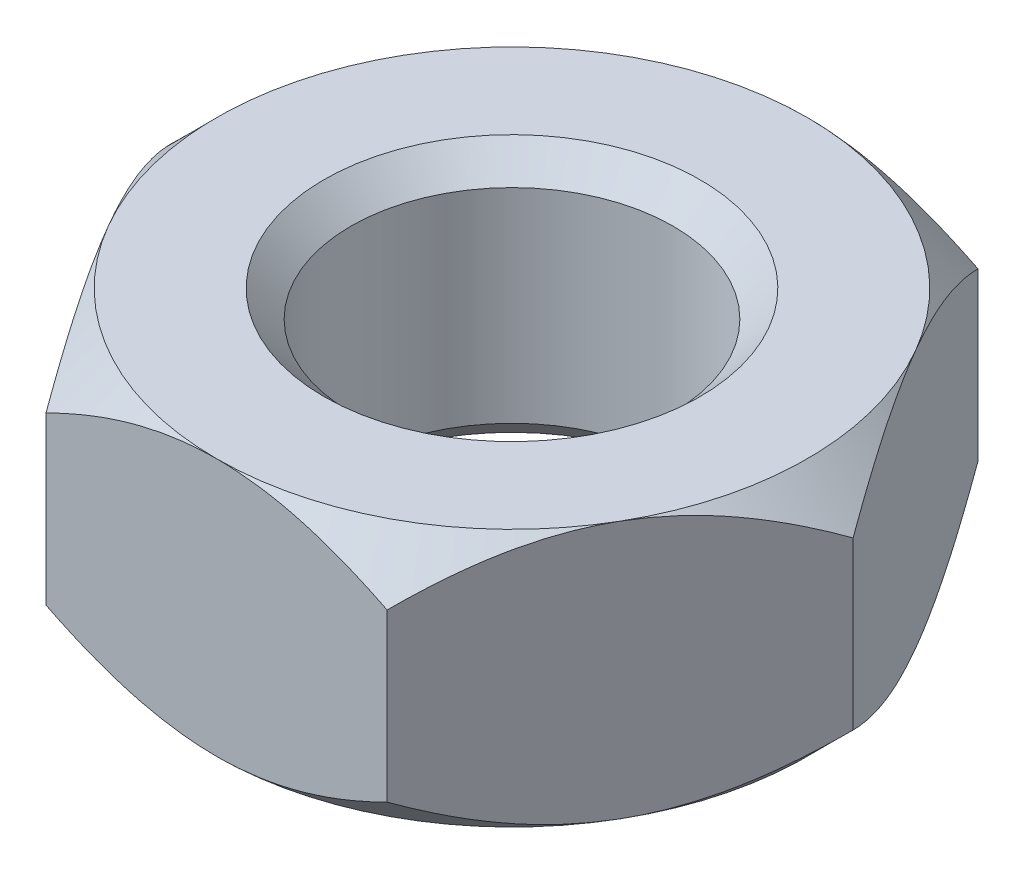
ISO-10303-21;
HEADER;
FILE_DESCRIPTION(('STEP AP214'),'2;1');
FILE_NAME('part.step','',(''),(''),'','','');
FILE_SCHEMA(('AUTOMOTIVE_DESIGN { 1 0 10303 214 1 1 1 1 }'));
ENDSEC;
DATA;
#1=APPLICATION_CONTEXT('core data for automotive mechanical design processes');
#2=APPLICATION_PROTOCOL_DEFINITION('international standard','automotive_design',2000,#1);
#3=PRODUCT_CONTEXT('',#1,'mechanical');
#4=PRODUCT('Part','Part','',(#3));
#5=PRODUCT_RELATED_PRODUCT_CATEGORY('part','',(#4));
#6=PRODUCT_DEFINITION_FORMATION('','',#4);
#7=PRODUCT_DEFINITION_CONTEXT('part definition',#1,'design');
#8=PRODUCT_DEFINITION('design','',#6,#7);
#9=PRODUCT_DEFINITION_SHAPE('','',#8);
#10=(LENGTH_UNIT() NAMED_UNIT(*) SI_UNIT(.MILLI.,.METRE.));
#11=(NAMED_UNIT(*) PLANE_ANGLE_UNIT() SI_UNIT($,.RADIAN.));
#12=(NAMED_UNIT(*) SI_UNIT($,.STERADIAN.) SOLID_ANGLE_UNIT());
#13=UNCERTAINTY_MEASURE_WITH_UNIT(LENGTH_MEASURE(1.E-05),#10,'distance_accuracy_value','');
#14=(GEOMETRIC_REPRESENTATION_CONTEXT(3) GLOBAL_UNCERTAINTY_ASSIGNED_CONTEXT((#13)) GLOBAL_UNIT_ASSIGNED_CONTEXT((#10,
#11,#12)) REPRESENTATION_CONTEXT('',''));
#15=CARTESIAN_POINT('',(0.,0.,0.));
#16=DIRECTION('',(0.,0.,1.));
#17=DIRECTION('',(1.,0.,0.));
#18=AXIS2_PLACEMENT_3D('',#15,#16,#17);
#19=CARTESIAN_POINT('',(0.,2.4,2.75));
#20=DIRECTION('',(0.,0.,-1.));
#21=DIRECTION('',(-1.,0.,0.));
#22=AXIS2_PLACEMENT_3D('',#19,#20,#21);
#23=PLANE('',#22);
#24=CARTESIAN_POINT('',(-3.57112123048818,1.75726156805253,2.75));
#25=CARTESIAN_POINT('',(-3.48574430504437,1.6896318648555,2.75));
#26=CARTESIAN_POINT('',(-3.39993787766819,1.62253635664774,2.75));
#27=CARTESIAN_POINT('',(-3.22728052865908,1.4896656720613,2.75));
#28=CARTESIAN_POINT('',(-3.14042938728946,1.42389078149977,2.75));
#29=CARTESIAN_POINT('',(-2.96486869524019,1.29344848280675,2.75));
#30=CARTESIAN_POINT('',(-2.8761500356758,1.22879329655884,2.75));
#31=CARTESIAN_POINT('',(-2.69729269204007,1.10148535993676,2.75));
#32=CARTESIAN_POINT('',(-2.60715410326676,1.03883247602641,2.75));
#33=CARTESIAN_POINT('',(-2.41840275638711,0.911415572467526,2.75));
#34=CARTESIAN_POINT('',(-2.3196598853465,0.846843352358625,2.75));
#35=CARTESIAN_POINT('',(-2.11984686682476,0.721340304065986,2.75));
#36=CARTESIAN_POINT('',(-2.01877629430811,0.660410148339995,2.75));
#37=CARTESIAN_POINT('',(-1.81421853991552,0.543458089462744,2.75));
#38=CARTESIAN_POINT('',(-1.71073958578057,0.487421907433462,2.75));
#39=CARTESIAN_POINT('',(-1.50069861159212,0.381513269750787,2.75));
#40=CARTESIAN_POINT('',(-1.39413817091264,0.331637723301281,2.75));
#41=CARTESIAN_POINT('',(-1.19118474473753,0.245675860330104,2.75));
#42=CARTESIAN_POINT('',(-1.09519613390678,0.208644392579135,2.75));
#43=CARTESIAN_POINT('',(-0.900551286140332,0.14225363721217,2.75));
#44=CARTESIAN_POINT('',(-0.801894895995169,0.112894791268699,2.75));
#45=CARTESIAN_POINT('',(-0.604366756853834,0.0640380979222952,2.75));
#46=CARTESIAN_POINT('',(-0.505544728188573,0.0443428042195567,2.75));
#47=CARTESIAN_POINT('',(-0.306386291852734,0.0152643735237227,2.75));
#48=CARTESIAN_POINT('',(-0.206050319541373,0.00587832714519468,2.75));
#49=CARTESIAN_POINT('',(-0.0108664169761356,-0.00160558688675908,2.75));
#50=CARTESIAN_POINT('',(0.083957271079694,-0.0003348017554669,2.75));
#51=CARTESIAN_POINT('',(0.27297134425492,0.0119042729439363,2.75));
#52=CARTESIAN_POINT('',(0.367161679433115,0.0228733184108846,2.75));
#53=CARTESIAN_POINT('',(0.555841326304052,0.0540372019465188,2.75));
#54=CARTESIAN_POINT('',(0.650301484227614,0.0744055867829754,2.75));
#55=CARTESIAN_POINT('',(0.837080407271525,0.123164499288071,2.75));
#56=CARTESIAN_POINT('',(0.92939918565339,0.151554977261706,2.75));
#57=CARTESIAN_POINT('',(1.20448144887619,0.247241103955768,2.75));
#58=CARTESIAN_POINT('',(1.38370489122084,0.3247319924471,2.75));
#59=CARTESIAN_POINT('',(1.64604114182912,0.454086475754211,2.75));
#60=CARTESIAN_POINT('',(1.73256013900497,0.499488921753909,2.75));
#61=CARTESIAN_POINT('',(1.90364648134438,0.593840934041832,2.75));
#62=CARTESIAN_POINT('',(1.9882141569402,0.642789893872725,2.75));
#63=CARTESIAN_POINT('',(2.15149323308838,0.741043784188588,2.75));
#64=CARTESIAN_POINT('',(2.23028776438712,0.790212106199067,2.75));
#65=CARTESIAN_POINT('',(2.38652448297565,0.89066216695283,2.75));
#66=CARTESIAN_POINT('',(2.46396656994359,0.941944061537008,2.75));
#67=CARTESIAN_POINT('',(2.61705774522688,1.04583317770132,2.75));
#68=CARTESIAN_POINT('',(2.69271617528745,1.09842669026765,2.75));
#69=CARTESIAN_POINT('',(2.84299233564062,1.20503848215924,2.75));
#70=CARTESIAN_POINT('',(2.91761034677506,1.25905636515631,2.75));
#71=CARTESIAN_POINT('',(2.99179148211429,1.31365799157011,2.75));
#72=B_SPLINE_CURVE_WITH_KNOTS('',3,(#24,#25,#26,#27,#28,#29,#30,#31,#32,#33,#34,#35,#36,#37,#38,
#39,#40,#41,#42,#43,#44,#45,#46,#47,#48,#49,#50,#51,#52,#53,#54,#55,#56,#57,#58,#59,#60,#61,#62,
#63,#64,#65,#66,#67,#68,#69,#70,#71),.UNSPECIFIED.,.F.,.F.,(4,2,2,2,2,2,2,2,2,2,2,2,2,2,2,2,2,2,
2,2,2,2,2,4),(0.,0.32675738879638,0.653584750525323,0.982896908898169,1.31218705898419,
1.66607030628039,2.02001869276111,2.37289724588534,2.72559803418962,3.03399157942658,
3.34240287335127,3.64421896445423,3.94594985776254,4.22993737473394,4.51394702812488,
4.80342435052153,5.09289987971273,5.67688503223711,5.96998339099376,6.26303174740069,
6.54162777866057,6.82024438863203,7.09665491614219,7.3729893280903),.UNSPECIFIED.);
#73=CARTESIAN_POINT('',(1.58771324027147,0.425426480542941,2.75));
#74=VERTEX_POINT('',#73);
#75=CARTESIAN_POINT('',(0.,0.,2.75));
#76=VERTEX_POINT('',#75);
#77=EDGE_CURVE('E123',#74,#76,#72,.F.);
#78=ORIENTED_EDGE('',*,*,#77,.F.);
#79=DIRECTION('',(0.,-1.,0.));
#80=VECTOR('',#79,1.);
#81=CARTESIAN_POINT('',(1.58771324027147,2.4,2.75));
#82=LINE('',#81,#80);
#83=CARTESIAN_POINT('',(1.58771324027147,1.97457351945706,2.75));
#84=VERTEX_POINT('',#83);
#85=EDGE_CURVE('E321',#84,#74,#82,.T.);
#86=ORIENTED_EDGE('',*,*,#85,.F.);
#87=CARTESIAN_POINT('',(-3.57112123048817,0.642738431947468,2.75));
#88=CARTESIAN_POINT('',(-3.48574430504436,0.710368135144498,2.75));
#89=CARTESIAN_POINT('',(-3.39993787766819,0.777463643352259,2.75));
#90=CARTESIAN_POINT('',(-3.22728052865908,0.910334327938698,2.75));
#91=CARTESIAN_POINT('',(-3.14042938728946,0.976109218500228,2.75));
#92=CARTESIAN_POINT('',(-2.96486869524019,1.10655151719325,2.75));
#93=CARTESIAN_POINT('',(-2.8761500356758,1.17120670344116,2.75));
#94=CARTESIAN_POINT('',(-2.69729269204007,1.29851464006324,2.75));
#95=CARTESIAN_POINT('',(-2.60715410326675,1.36116752397359,2.75));
#96=CARTESIAN_POINT('',(-2.41840275638711,1.48858442753247,2.75));
#97=CARTESIAN_POINT('',(-2.3196598853465,1.55315664764137,2.75));
#98=CARTESIAN_POINT('',(-2.11984686682476,1.67865969593401,2.75));
#99=CARTESIAN_POINT('',(-2.01877629430811,1.73958985166,2.75));
#100=CARTESIAN_POINT('',(-1.81421853991552,1.85654191053725,2.75));
#101=CARTESIAN_POINT('',(-1.71073958578057,1.91257809256654,2.75));
#102=CARTESIAN_POINT('',(-1.50069861159212,2.01848673024921,2.75));
#103=CARTESIAN_POINT('',(-1.39413817091264,2.06836227669872,2.75));
#104=CARTESIAN_POINT('',(-1.19118474473753,2.1543241396699,2.75));
#105=CARTESIAN_POINT('',(-1.09519613390678,2.19135560742086,2.75));
#106=CARTESIAN_POINT('',(-0.900551286140334,2.25774636278783,2.75));
#107=CARTESIAN_POINT('',(-0.801894895995171,2.2871052087313,2.75));
#108=CARTESIAN_POINT('',(-0.604366756853836,2.3359619020777,2.75));
#109=CARTESIAN_POINT('',(-0.505544728188575,2.35565719578044,2.75));
#110=CARTESIAN_POINT('',(-0.306386291852736,2.38473562647628,2.75));
#111=CARTESIAN_POINT('',(-0.206050319541376,2.39412167285481,2.75));
#112=CARTESIAN_POINT('',(-0.0108664169761377,2.40160558688676,2.75));
#113=CARTESIAN_POINT('',(0.083957271079692,2.40033480175547,2.75));
#114=CARTESIAN_POINT('',(0.272971344254918,2.38809572705606,2.75));
#115=CARTESIAN_POINT('',(0.367161679433113,2.37712668158912,2.75));
#116=CARTESIAN_POINT('',(0.55584132630405,2.34596279805348,2.75));
#117=CARTESIAN_POINT('',(0.650301484227611,2.32559441321703,2.75));
#118=CARTESIAN_POINT('',(0.837080407271523,2.27683550071193,2.75));
#119=CARTESIAN_POINT('',(0.929399185653387,2.24844502273829,2.75));
#120=CARTESIAN_POINT('',(1.20448144887619,2.15275889604423,2.75));
#121=CARTESIAN_POINT('',(1.38370489122083,2.0752680075529,2.75));
#122=CARTESIAN_POINT('',(1.64604114182912,1.94591352424579,2.75));
#123=CARTESIAN_POINT('',(1.73256013900496,1.90051107824609,2.75));
#124=CARTESIAN_POINT('',(1.90364648134438,1.80615906595817,2.75));
#125=CARTESIAN_POINT('',(1.98821415694019,1.75721010612728,2.75));
#126=CARTESIAN_POINT('',(2.15149323308838,1.65895621581142,2.75));
#127=CARTESIAN_POINT('',(2.23028776438711,1.60978789380094,2.75));
#128=CARTESIAN_POINT('',(2.38652448297564,1.50933783304717,2.75));
#129=CARTESIAN_POINT('',(2.46396656994358,1.458055938463,2.75));
#130=CARTESIAN_POINT('',(2.61705774522687,1.35416682229869,2.75));
#131=CARTESIAN_POINT('',(2.69271617528744,1.30157330973236,2.75));
#132=CARTESIAN_POINT('',(2.84299233564061,1.19496151784076,2.75));
#133=CARTESIAN_POINT('',(2.91761034677505,1.1409436348437,2.75));
#134=CARTESIAN_POINT('',(2.99179148211428,1.0863420084299,2.75));
#135=B_SPLINE_CURVE_WITH_KNOTS('',3,(#87,#88,#89,#90,#91,#92,#93,#94,#95,#96,#97,#98,#99,#100,
#101,#102,#103,#104,#105,#106,#107,#108,#109,#110,#111,#112,#113,#114,#115,#116,#117,#118,#119,
#120,#121,#122,#123,#124,#125,#126,#127,#128,#129,#130,#131,#132,#133,#134),.UNSPECIFIED.,.F.,
.F.,(4,2,2,2,2,2,2,2,2,2,2,2,2,2,2,2,2,2,2,2,2,2,2,4),(0.,0.326757388796379,0.653584750525322,
0.982896908898168,1.31218705898419,1.66607030628038,2.02001869276111,2.37289724588534,
2.72559803418961,3.03399157942658,3.34240287335126,3.64421896445422,3.94594985776253,
4.22993737473394,4.51394702812487,4.80342435052153,5.09289987971273,5.6768850322371,
5.96998339099375,6.26303174740068,6.54162777866056,6.82024438863202,7.09665491614217,
7.37298932809029),.UNSPECIFIED.);
#136=CARTESIAN_POINT('',(0.,2.4,2.75));
#137=VERTEX_POINT('',#136);
#138=EDGE_CURVE('E194',#137,#84,#135,.T.);
#139=ORIENTED_EDGE('',*,*,#138,.F.);
#140=CARTESIAN_POINT('',(-1.58771324027147,1.97457351945706,2.75));
#141=VERTEX_POINT('',#140);
#142=EDGE_CURVE('E201',#141,#137,#135,.T.);
#143=ORIENTED_EDGE('',*,*,#142,.F.);
#144=DIRECTION('',(0.,-1.,0.));
#145=VECTOR('',#144,1.);
#146=CARTESIAN_POINT('',(-1.58771324027147,2.4,2.75));
#147=LINE('',#146,#145);
#148=CARTESIAN_POINT('',(-1.58771324027147,0.425426480542941,2.75));
#149=VERTEX_POINT('',#148);
#150=EDGE_CURVE('E158',#141,#149,#147,.T.);
#151=ORIENTED_EDGE('',*,*,#150,.T.);
#152=EDGE_CURVE('E136',#76,#149,#72,.F.);
#153=ORIENTED_EDGE('',*,*,#152,.F.);
#154=EDGE_LOOP('',(#78,#86,#139,#143,#151,#153));
#155=FACE_BOUND('',#154,.T.);
#156=ADVANCED_FACE('F34',(#155),#23,.F.);
#157=CARTESIAN_POINT('',(2.38156986040721,2.4,1.375));
#158=DIRECTION('',(-0.866025403784439,0.,-0.5));
#159=DIRECTION('',(-0.5,0.,0.866025403784439));
#160=AXIS2_PLACEMENT_3D('',#157,#158,#159);
#161=PLANE('',#160);
#162=CARTESIAN_POINT('',(3.17554195059678,0.425541956894916,-0.0002));
#163=CARTESIAN_POINT('',(3.12096451019372,0.371010993648794,0.0943308997251541));
#164=CARTESIAN_POINT('',(3.06547446347008,0.319682711582697,0.190442479964883));
#165=CARTESIAN_POINT('',(2.95232415552349,0.225701848080582,0.386424562220432));
#166=CARTESIAN_POINT('',(2.89465313346251,0.183101557290613,0.486313702554478));
#167=CARTESIAN_POINT('',(2.77836227110502,0.11012642806495,0.68773538461365));
#168=CARTESIAN_POINT('',(2.71977204694419,0.0795681696782808,0.789216629687064));
#169=CARTESIAN_POINT('',(2.60130175305013,0.0324868359858966,0.994413197899183));
#170=CARTESIAN_POINT('',(2.54142530239377,0.0159286158992983,1.09812225261289));
#171=CARTESIAN_POINT('',(2.43823122487549,0.00098880787637078,1.27685963791476));
#172=CARTESIAN_POINT('',(2.39504691271491,-0.00122274739977306,1.3516570606668));
#173=CARTESIAN_POINT('',(2.30874888176718,0.00250321758747709,1.50112963486142));
#174=CARTESIAN_POINT('',(2.26563519303236,0.00844359470887717,1.57580473425183));
#175=CARTESIAN_POINT('',(2.17981491306544,0.0281353796034415,1.72444981947433));
#176=CARTESIAN_POINT('',(2.13710883164785,0.041895524927414,1.79841892228176));
#177=CARTESIAN_POINT('',(2.05243516150699,0.0764715186152192,1.94507802102907));
#178=CARTESIAN_POINT('',(2.01046751642767,0.0972868260643671,2.01776811458045));
#179=CARTESIAN_POINT('',(1.90297266759401,0.159080271248454,2.20395465431229));
#180=CARTESIAN_POINT('',(1.83811191884128,0.204715808523914,2.31629676656898));
#181=CARTESIAN_POINT('',(1.74273981029545,0.281754639324321,2.48148610419533));
#182=CARTESIAN_POINT('',(1.71131043208803,0.308822507519967,2.53592338410088));
#183=CARTESIAN_POINT('',(1.64903383378715,0.365425651693316,2.64378961648056));
#184=CARTESIAN_POINT('',(1.61818627041469,0.394959413135863,2.69721916353136));
#185=CARTESIAN_POINT('',(1.58759777021763,0.425541956894917,2.7502));
#186=B_SPLINE_CURVE_WITH_KNOTS('',3,(#162,#163,#164,#165,#166,#167,#168,#169,#170,#171,#172,
#173,#174,#175,#176,#177,#178,#179,#180,#181,#182,#183,#184,#185),.UNSPECIFIED.,.F.,.F.,(4,2,2,
2,2,2,2,2,2,2,2,4),(0.,0.366307821078205,0.734749902229765,1.09734036165939,1.45901787214334,
1.71784182927395,1.97675651485027,2.23596107357797,2.49514576375463,2.90682558871158,
3.11210731416953,3.31726387159445),.UNSPECIFIED.);
#187=CARTESIAN_POINT('',(3.17542648054294,0.425426480542941,0.));
#188=VERTEX_POINT('',#187);
#189=CARTESIAN_POINT('',(2.38156986040721,0.,1.375));
#190=VERTEX_POINT('',#189);
#191=EDGE_CURVE('E49',#188,#190,#186,.T.);
#192=ORIENTED_EDGE('',*,*,#191,.F.);
#193=DIRECTION('',(0.,-1.,0.));
#194=VECTOR('',#193,1.);
#195=CARTESIAN_POINT('',(3.17542648054294,2.4,0.));
#196=LINE('',#195,#194);
#197=CARTESIAN_POINT('',(3.17542648054294,1.97457351945706,0.));
#198=VERTEX_POINT('',#197);
#199=EDGE_CURVE('E315',#198,#188,#196,.T.);
#200=ORIENTED_EDGE('',*,*,#199,.F.);
#201=CARTESIAN_POINT('',(1.58759777021763,1.97445804310508,2.7502));
#202=CARTESIAN_POINT('',(1.64217521062069,2.02898900635121,2.65566910027485));
#203=CARTESIAN_POINT('',(1.69766525734434,2.0803172884173,2.55955752003512));
#204=CARTESIAN_POINT('',(1.81081556529092,2.17429815191942,2.36357543777957));
#205=CARTESIAN_POINT('',(1.8684865873519,2.21689844270939,2.26368629744552));
#206=CARTESIAN_POINT('',(1.98477744970939,2.28987357193505,2.06226461538635));
#207=CARTESIAN_POINT('',(2.04336767387023,2.32043183032172,1.96078337031294));
#208=CARTESIAN_POINT('',(2.16183796776428,2.3675131640141,1.75558680210082));
#209=CARTESIAN_POINT('',(2.22171441842064,2.3840713841007,1.65187774738711));
#210=CARTESIAN_POINT('',(2.32490849593892,2.39901119212363,1.47314036208524));
#211=CARTESIAN_POINT('',(2.3680928080995,2.40122274739977,1.39834293933321));
#212=CARTESIAN_POINT('',(2.45439083904723,2.39749678241252,1.24887036513859));
#213=CARTESIAN_POINT('',(2.49750452778205,2.39155640529112,1.17419526574817));
#214=CARTESIAN_POINT('',(2.58332480774897,2.37186462039656,1.02555018052568));
#215=CARTESIAN_POINT('',(2.62603088916656,2.35810447507259,0.951581077718245));
#216=CARTESIAN_POINT('',(2.71070455930743,2.32352848138478,0.804921978970936));
#217=CARTESIAN_POINT('',(2.75267220438674,2.30271317393563,0.732231885419551));
#218=CARTESIAN_POINT('',(2.8601670532204,2.24091972875155,0.546045345687707));
#219=CARTESIAN_POINT('',(2.92502780197313,2.19528419147609,0.433703233431023));
#220=CARTESIAN_POINT('',(3.02039991051896,2.11824536067568,0.268513895804667));
#221=CARTESIAN_POINT('',(3.05182928872638,2.09117749248003,0.214076615899117));
#222=CARTESIAN_POINT('',(3.11410588702726,2.03457434830668,0.10621038351944));
#223=CARTESIAN_POINT('',(3.14495345039972,2.00504058686414,0.0527808364686404));
#224=CARTESIAN_POINT('',(3.17554195059678,1.97445804310508,-0.000200000000000015));
#225=B_SPLINE_CURVE_WITH_KNOTS('',3,(#201,#202,#203,#204,#205,#206,#207,#208,#209,#210,#211,
#212,#213,#214,#215,#216,#217,#218,#219,#220,#221,#222,#223,#224),.UNSPECIFIED.,.F.,.F.,(4,2,2,
2,2,2,2,2,2,2,2,4),(0.,0.366307821078205,0.734749902229765,1.09734036165939,1.45901787214334,
1.71784182927395,1.97675651485027,2.23596107357796,2.49514576375462,2.90682558871158,
3.11210731416953,3.31726387159445),.UNSPECIFIED.);
#226=CARTESIAN_POINT('',(2.38156986040721,2.4,1.375));
#227=VERTEX_POINT('',#226);
#228=EDGE_CURVE('E203',#227,#198,#225,.T.);
#229=ORIENTED_EDGE('',*,*,#228,.F.);
#230=EDGE_CURVE('E202',#84,#227,#225,.T.);
#231=ORIENTED_EDGE('',*,*,#230,.F.);
#232=ORIENTED_EDGE('',*,*,#85,.T.);
#233=EDGE_CURVE('E130',#190,#74,#186,.T.);
#234=ORIENTED_EDGE('',*,*,#233,.F.);
#235=EDGE_LOOP('',(#192,#200,#229,#231,#232,#234));
#236=FACE_BOUND('',#235,.T.);
#237=ADVANCED_FACE('F188',(#236),#161,.F.);
#238=CARTESIAN_POINT('',(2.38156986040721,2.4,-1.375));
#239=DIRECTION('',(-0.866025403784438,0.,0.5));
#240=DIRECTION('',(0.5,0.,0.866025403784439));
#241=AXIS2_PLACEMENT_3D('',#238,#239,#240);
#242=PLANE('',#241);
#243=CARTESIAN_POINT('',(1.58759777021763,0.425541956894916,-2.7502));
#244=CARTESIAN_POINT('',(1.64217521062069,0.371010993648795,-2.65566910027485));
#245=CARTESIAN_POINT('',(1.69766525734434,0.319682711582697,-2.55955752003512));
#246=CARTESIAN_POINT('',(1.81081556529092,0.225701848080581,-2.36357543777957));
#247=CARTESIAN_POINT('',(1.8684865873519,0.183101557290613,-2.26368629744552));
#248=CARTESIAN_POINT('',(1.98477744970939,0.11012642806495,-2.06226461538635));
#249=CARTESIAN_POINT('',(2.04336767387023,0.0795681696782807,-1.96078337031294));
#250=CARTESIAN_POINT('',(2.16183796776428,0.0324868359858964,-1.75558680210082));
#251=CARTESIAN_POINT('',(2.22171441842064,0.0159286158992979,-1.65187774738711));
#252=CARTESIAN_POINT('',(2.32490849593892,0.000988807876370441,-1.47314036208524));
#253=CARTESIAN_POINT('',(2.3680928080995,-0.0012227473997732,-1.3983429393332));
#254=CARTESIAN_POINT('',(2.45439083904723,0.00250321758747728,-1.24887036513858));
#255=CARTESIAN_POINT('',(2.49750452778205,0.00844359470887745,-1.17419526574817));
#256=CARTESIAN_POINT('',(2.58332480774897,0.0281353796034418,-1.02555018052567));
#257=CARTESIAN_POINT('',(2.62603088916656,0.0418955249274143,-0.951581077718243));
#258=CARTESIAN_POINT('',(2.71070455930743,0.0764715186152193,-0.804921978970934));
#259=CARTESIAN_POINT('',(2.75267220438674,0.0972868260643672,-0.732231885419548));
#260=CARTESIAN_POINT('',(2.8601670532204,0.159080271248454,-0.546045345687705));
#261=CARTESIAN_POINT('',(2.92502780197313,0.204715808523914,-0.433703233431021));
#262=CARTESIAN_POINT('',(3.02039991051896,0.281754639324321,-0.268513895804666));
#263=CARTESIAN_POINT('',(3.05182928872638,0.308822507519967,-0.214076615899116));
#264=CARTESIAN_POINT('',(3.11410588702726,0.365425651693316,-0.106210383519439));
#265=CARTESIAN_POINT('',(3.14495345039972,0.394959413135863,-0.05278083646864));
#266=CARTESIAN_POINT('',(3.17554195059678,0.425541956894917,0.00020000000000011));
#267=B_SPLINE_CURVE_WITH_KNOTS('',3,(#243,#244,#245,#246,#247,#248,#249,#250,#251,#252,#253,
#254,#255,#256,#257,#258,#259,#260,#261,#262,#263,#264,#265,#266),.UNSPECIFIED.,.F.,.F.,(4,2,2,
2,2,2,2,2,2,2,2,4),(0.,0.366307821078205,0.734749902229766,1.09734036165939,1.45901787214334,
1.71784182927395,1.97675651485027,2.23596107357797,2.49514576375463,2.90682558871158,
3.11210731416953,3.31726387159445),.UNSPECIFIED.);
#268=CARTESIAN_POINT('',(1.58771324027147,0.425426480542941,-2.75));
#269=VERTEX_POINT('',#268);
#270=CARTESIAN_POINT('',(2.38156986040721,0.,-1.375));
#271=VERTEX_POINT('',#270);
#272=EDGE_CURVE('E57',#269,#271,#267,.T.);
#273=ORIENTED_EDGE('',*,*,#272,.F.);
#274=DIRECTION('',(0.,-1.,0.));
#275=VECTOR('',#274,1.);
#276=CARTESIAN_POINT('',(1.58771324027147,2.4,-2.75));
#277=LINE('',#276,#275);
#278=CARTESIAN_POINT('',(1.58771324027147,1.97457351945706,-2.75));
#279=VERTEX_POINT('',#278);
#280=EDGE_CURVE('E312',#279,#269,#277,.T.);
#281=ORIENTED_EDGE('',*,*,#280,.F.);
#282=CARTESIAN_POINT('',(3.17554195059678,1.97445804310508,0.00020000000000006));
#283=CARTESIAN_POINT('',(3.12096451019372,2.0289890063512,-0.0943308997251538));
#284=CARTESIAN_POINT('',(3.06547446347008,2.0803172884173,-0.190442479964883));
#285=CARTESIAN_POINT('',(2.95232415552349,2.17429815191942,-0.386424562220431));
#286=CARTESIAN_POINT('',(2.89465313346251,2.21689844270939,-0.486313702554477));
#287=CARTESIAN_POINT('',(2.77836227110502,2.28987357193505,-0.687735384613648));
#288=CARTESIAN_POINT('',(2.71977204694419,2.32043183032172,-0.789216629687062));
#289=CARTESIAN_POINT('',(2.60130175305013,2.3675131640141,-0.99441319789918));
#290=CARTESIAN_POINT('',(2.54142530239377,2.3840713841007,-1.09812225261289));
#291=CARTESIAN_POINT('',(2.43823122487549,2.39901119212363,-1.27685963791476));
#292=CARTESIAN_POINT('',(2.39504691271491,2.40122274739977,-1.35165706066679));
#293=CARTESIAN_POINT('',(2.30874888176718,2.39749678241252,-1.50112963486141));
#294=CARTESIAN_POINT('',(2.26563519303236,2.39155640529112,-1.57580473425183));
#295=CARTESIAN_POINT('',(2.17981491306544,2.37186462039656,-1.72444981947432));
#296=CARTESIAN_POINT('',(2.13710883164786,2.35810447507259,-1.79841892228175));
#297=CARTESIAN_POINT('',(2.05243516150699,2.32352848138478,-1.94507802102906));
#298=CARTESIAN_POINT('',(2.01046751642768,2.30271317393563,-2.01776811458045));
#299=CARTESIAN_POINT('',(1.90297266759401,2.24091972875155,-2.20395465431229));
#300=CARTESIAN_POINT('',(1.83811191884128,2.19528419147609,-2.31629676656898));
#301=CARTESIAN_POINT('',(1.74273981029545,2.11824536067568,-2.48148610419533));
#302=CARTESIAN_POINT('',(1.71131043208803,2.09117749248003,-2.53592338410088));
#303=CARTESIAN_POINT('',(1.64903383378715,2.03457434830668,-2.64378961648056));
#304=CARTESIAN_POINT('',(1.61818627041469,2.00504058686414,-2.69721916353136));
#305=CARTESIAN_POINT('',(1.58759777021763,1.97445804310508,-2.7502));
#306=B_SPLINE_CURVE_WITH_KNOTS('',3,(#282,#283,#284,#285,#286,#287,#288,#289,#290,#291,#292,
#293,#294,#295,#296,#297,#298,#299,#300,#301,#302,#303,#304,#305),.UNSPECIFIED.,.F.,.F.,(4,2,2,
2,2,2,2,2,2,2,2,4),(0.,0.366307821078205,0.734749902229764,1.09734036165939,1.45901787214334,
1.71784182927395,1.97675651485026,2.23596107357796,2.49514576375462,2.90682558871158,
3.11210731416953,3.31726387159445),.UNSPECIFIED.);
#307=CARTESIAN_POINT('',(2.38156986040721,2.4,-1.375));
#308=VERTEX_POINT('',#307);
#309=EDGE_CURVE('E244',#308,#279,#306,.T.);
#310=ORIENTED_EDGE('',*,*,#309,.F.);
#311=EDGE_CURVE('E249',#198,#308,#306,.T.);
#312=ORIENTED_EDGE('',*,*,#311,.F.);
#313=ORIENTED_EDGE('',*,*,#199,.T.);
#314=EDGE_CURVE('E259',#271,#188,#267,.T.);
#315=ORIENTED_EDGE('',*,*,#314,.F.);
#316=EDGE_LOOP('',(#273,#281,#310,#312,#313,#315));
#317=FACE_BOUND('',#316,.T.);
#318=ADVANCED_FACE('F251',(#317),#242,.F.);
#319=CARTESIAN_POINT('',(0.,2.4,-2.75));
#320=DIRECTION('',(0.,0.,1.));
#321=DIRECTION('',(1.,0.,0.));
#322=AXIS2_PLACEMENT_3D('',#319,#320,#321);
#323=PLANE('',#322);
#324=CARTESIAN_POINT('',(-3.57112123048817,1.75726156805253,-2.75));
#325=CARTESIAN_POINT('',(-3.48574430504436,1.6896318648555,-2.75));
#326=CARTESIAN_POINT('',(-3.39993787766819,1.62253635664774,-2.75));
#327=CARTESIAN_POINT('',(-3.22728052865908,1.4896656720613,-2.75));
#328=CARTESIAN_POINT('',(-3.14042938728946,1.42389078149977,-2.75));
#329=CARTESIAN_POINT('',(-2.96486869524019,1.29344848280675,-2.75));
#330=CARTESIAN_POINT('',(-2.8761500356758,1.22879329655884,-2.75));
#331=CARTESIAN_POINT('',(-2.69729269204007,1.10148535993676,-2.75));
#332=CARTESIAN_POINT('',(-2.60715410326675,1.03883247602641,-2.75));
#333=CARTESIAN_POINT('',(-2.41840275638711,0.911415572467525,-2.75));
#334=CARTESIAN_POINT('',(-2.3196598853465,0.846843352358625,-2.75));
#335=CARTESIAN_POINT('',(-2.11984686682476,0.721340304065986,-2.75));
#336=CARTESIAN_POINT('',(-2.01877629430811,0.660410148339995,-2.75));
#337=CARTESIAN_POINT('',(-1.81421853991552,0.543458089462744,-2.75));
#338=CARTESIAN_POINT('',(-1.71073958578057,0.487421907433462,-2.75));
#339=CARTESIAN_POINT('',(-1.50069861159212,0.381513269750787,-2.75));
#340=CARTESIAN_POINT('',(-1.39413817091264,0.331637723301281,-2.75));
#341=CARTESIAN_POINT('',(-1.19118474473753,0.245675860330104,-2.75));
#342=CARTESIAN_POINT('',(-1.09519613390678,0.208644392579135,-2.75));
#343=CARTESIAN_POINT('',(-0.900551286140333,0.14225363721217,-2.75));
#344=CARTESIAN_POINT('',(-0.801894895995169,0.112894791268699,-2.75));
#345=CARTESIAN_POINT('',(-0.604366756853834,0.0640380979222952,-2.75));
#346=CARTESIAN_POINT('',(-0.505544728188573,0.0443428042195566,-2.75));
#347=CARTESIAN_POINT('',(-0.306386291852734,0.0152643735237226,-2.75));
#348=CARTESIAN_POINT('',(-0.206050319541374,0.00587832714519459,-2.75));
#349=CARTESIAN_POINT('',(-0.0108664169761356,-0.00160558688675918,-2.75));
#350=CARTESIAN_POINT('',(0.0839572710796943,-0.000334801755466988,-2.75));
#351=CARTESIAN_POINT('',(0.272971344254921,0.0119042729439362,-2.75));
#352=CARTESIAN_POINT('',(0.367161679433116,0.0228733184108845,-2.75));
#353=CARTESIAN_POINT('',(0.555841326304052,0.0540372019465189,-2.75));
#354=CARTESIAN_POINT('',(0.650301484227614,0.0744055867829756,-2.75));
#355=CARTESIAN_POINT('',(0.837080407271525,0.123164499288071,-2.75));
#356=CARTESIAN_POINT('',(0.92939918565339,0.151554977261706,-2.75));
#357=CARTESIAN_POINT('',(1.20448144887619,0.247241103955768,-2.75));
#358=CARTESIAN_POINT('',(1.38370489122084,0.3247319924471,-2.75));
#359=CARTESIAN_POINT('',(1.64604114182912,0.454086475754211,-2.75));
#360=CARTESIAN_POINT('',(1.73256013900497,0.499488921753909,-2.75));
#361=CARTESIAN_POINT('',(1.90364648134438,0.593840934041832,-2.75));
#362=CARTESIAN_POINT('',(1.9882141569402,0.642789893872725,-2.75));
#363=CARTESIAN_POINT('',(2.15149323308838,0.741043784188588,-2.75));
#364=CARTESIAN_POINT('',(2.23028776438712,0.790212106199067,-2.75));
#365=CARTESIAN_POINT('',(2.38652448297565,0.89066216695283,-2.75));
#366=CARTESIAN_POINT('',(2.46396656994359,0.941944061537008,-2.75));
#367=CARTESIAN_POINT('',(2.61705774522688,1.04583317770132,-2.75));
#368=CARTESIAN_POINT('',(2.69271617528745,1.09842669026765,-2.75));
#369=CARTESIAN_POINT('',(2.84299233564062,1.20503848215924,-2.75));
#370=CARTESIAN_POINT('',(2.91761034677506,1.25905636515631,-2.75));
#371=CARTESIAN_POINT('',(2.99179148211429,1.31365799157011,-2.75));
#372=B_SPLINE_CURVE_WITH_KNOTS('',3,(#324,#325,#326,#327,#328,#329,#330,#331,#332,#333,#334,
#335,#336,#337,#338,#339,#340,#341,#342,#343,#344,#345,#346,#347,#348,#349,#350,#351,#352,#353,
#354,#355,#356,#357,#358,#359,#360,#361,#362,#363,#364,#365,#366,#367,#368,#369,#370,#371),
.UNSPECIFIED.,.F.,.F.,(4,2,2,2,2,2,2,2,2,2,2,2,2,2,2,2,2,2,2,2,2,2,2,4),(0.,0.32675738879638,
0.653584750525322,0.982896908898169,1.31218705898419,1.66607030628038,2.02001869276111,
2.37289724588534,2.72559803418961,3.03399157942658,3.34240287335126,3.64421896445422,
3.94594985776253,4.22993737473394,4.51394702812488,4.80342435052153,5.09289987971273,
5.6768850322371,5.96998339099376,6.26303174740069,6.54162777866057,6.82024438863203,
7.09665491614218,7.3729893280903),.UNSPECIFIED.);
#373=CARTESIAN_POINT('',(-1.58771324027147,0.425426480542941,-2.75));
#374=VERTEX_POINT('',#373);
#375=CARTESIAN_POINT('',(0.,0.,-2.75));
#376=VERTEX_POINT('',#375);
#377=EDGE_CURVE('E174',#374,#376,#372,.T.);
#378=ORIENTED_EDGE('',*,*,#377,.F.);
#379=DIRECTION('',(0.,-1.,0.));
#380=VECTOR('',#379,1.);
#381=CARTESIAN_POINT('',(-1.58771324027147,2.4,-2.75));
#382=LINE('',#381,#380);
#383=CARTESIAN_POINT('',(-1.58771324027147,1.97457351945706,-2.75));
#384=VERTEX_POINT('',#383);
#385=EDGE_CURVE('E308',#384,#374,#382,.T.);
#386=ORIENTED_EDGE('',*,*,#385,.F.);
#387=CARTESIAN_POINT('',(-3.57112123048817,0.642738431947468,-2.75));
#388=CARTESIAN_POINT('',(-3.48574430504436,0.710368135144498,-2.75));
#389=CARTESIAN_POINT('',(-3.39993787766819,0.777463643352259,-2.75));
#390=CARTESIAN_POINT('',(-3.22728052865908,0.910334327938699,-2.75));
#391=CARTESIAN_POINT('',(-3.14042938728946,0.976109218500228,-2.75));
#392=CARTESIAN_POINT('',(-2.96486869524019,1.10655151719325,-2.75));
#393=CARTESIAN_POINT('',(-2.8761500356758,1.17120670344116,-2.75));
#394=CARTESIAN_POINT('',(-2.69729269204007,1.29851464006324,-2.75));
#395=CARTESIAN_POINT('',(-2.60715410326675,1.36116752397359,-2.75));
#396=CARTESIAN_POINT('',(-2.41840275638711,1.48858442753247,-2.75));
#397=CARTESIAN_POINT('',(-2.3196598853465,1.55315664764137,-2.75));
#398=CARTESIAN_POINT('',(-2.11984686682476,1.67865969593401,-2.75));
#399=CARTESIAN_POINT('',(-2.01877629430811,1.73958985166,-2.75));
#400=CARTESIAN_POINT('',(-1.81421853991552,1.85654191053726,-2.75));
#401=CARTESIAN_POINT('',(-1.71073958578057,1.91257809256654,-2.75));
#402=CARTESIAN_POINT('',(-1.50069861159212,2.01848673024921,-2.75));
#403=CARTESIAN_POINT('',(-1.39413817091264,2.06836227669872,-2.75));
#404=CARTESIAN_POINT('',(-1.19118474473753,2.1543241396699,-2.75));
#405=CARTESIAN_POINT('',(-1.09519613390678,2.19135560742086,-2.75));
#406=CARTESIAN_POINT('',(-0.900551286140333,2.25774636278783,-2.75));
#407=CARTESIAN_POINT('',(-0.80189489599517,2.2871052087313,-2.75));
#408=CARTESIAN_POINT('',(-0.604366756853835,2.3359619020777,-2.75));
#409=CARTESIAN_POINT('',(-0.505544728188574,2.35565719578044,-2.75));
#410=CARTESIAN_POINT('',(-0.306386291852735,2.38473562647628,-2.75));
#411=CARTESIAN_POINT('',(-0.206050319541375,2.39412167285481,-2.75));
#412=CARTESIAN_POINT('',(-0.0108664169761378,2.40160558688676,-2.75));
#413=CARTESIAN_POINT('',(0.0839572710796919,2.40033480175547,-2.75));
#414=CARTESIAN_POINT('',(0.272971344254918,2.38809572705606,-2.75));
#415=CARTESIAN_POINT('',(0.367161679433113,2.37712668158912,-2.75));
#416=CARTESIAN_POINT('',(0.555841326304049,2.34596279805348,-2.75));
#417=CARTESIAN_POINT('',(0.650301484227611,2.32559441321703,-2.75));
#418=CARTESIAN_POINT('',(0.837080407271522,2.27683550071193,-2.75));
#419=CARTESIAN_POINT('',(0.929399185653387,2.24844502273829,-2.75));
#420=CARTESIAN_POINT('',(1.20448144887619,2.15275889604423,-2.75));
#421=CARTESIAN_POINT('',(1.38370489122083,2.0752680075529,-2.75));
#422=CARTESIAN_POINT('',(1.64604114182912,1.94591352424579,-2.75));
#423=CARTESIAN_POINT('',(1.73256013900496,1.90051107824609,-2.75));
#424=CARTESIAN_POINT('',(1.90364648134438,1.80615906595817,-2.75));
#425=CARTESIAN_POINT('',(1.98821415694019,1.75721010612728,-2.75));
#426=CARTESIAN_POINT('',(2.15149323308837,1.65895621581142,-2.75));
#427=CARTESIAN_POINT('',(2.23028776438711,1.60978789380094,-2.75));
#428=CARTESIAN_POINT('',(2.38652448297564,1.50933783304717,-2.75));
#429=CARTESIAN_POINT('',(2.46396656994358,1.458055938463,-2.75));
#430=CARTESIAN_POINT('',(2.61705774522687,1.35416682229869,-2.75));
#431=CARTESIAN_POINT('',(2.69271617528744,1.30157330973236,-2.75));
#432=CARTESIAN_POINT('',(2.84299233564061,1.19496151784076,-2.75));
#433=CARTESIAN_POINT('',(2.91761034677505,1.1409436348437,-2.75));
#434=CARTESIAN_POINT('',(2.99179148211428,1.0863420084299,-2.75));
#435=B_SPLINE_CURVE_WITH_KNOTS('',3,(#387,#388,#389,#390,#391,#392,#393,#394,#395,#396,#397,
#398,#399,#400,#401,#402,#403,#404,#405,#406,#407,#408,#409,#410,#411,#412,#413,#414,#415,#416,
#417,#418,#419,#420,#421,#422,#423,#424,#425,#426,#427,#428,#429,#430,#431,#432,#433,#434),
.UNSPECIFIED.,.F.,.F.,(4,2,2,2,2,2,2,2,2,2,2,2,2,2,2,2,2,2,2,2,2,2,2,4),(0.,0.326757388796379,
0.653584750525322,0.982896908898167,1.31218705898419,1.66607030628038,2.02001869276111,
2.37289724588534,2.72559803418961,3.03399157942658,3.34240287335126,3.64421896445422,
3.94594985776253,4.22993737473394,4.51394702812487,4.80342435052153,5.09289987971273,
5.6768850322371,5.96998339099375,6.26303174740068,6.54162777866056,6.82024438863202,
7.09665491614217,7.37298932809029),.UNSPECIFIED.);
#436=CARTESIAN_POINT('',(0.,2.4,-2.75));
#437=VERTEX_POINT('',#436);
#438=EDGE_CURVE('E239',#437,#384,#435,.F.);
#439=ORIENTED_EDGE('',*,*,#438,.F.);
#440=EDGE_CURVE('E250',#279,#437,#435,.F.);
#441=ORIENTED_EDGE('',*,*,#440,.F.);
#442=ORIENTED_EDGE('',*,*,#280,.T.);
#443=EDGE_CURVE('E264',#376,#269,#372,.T.);
#444=ORIENTED_EDGE('',*,*,#443,.F.);
#445=EDGE_LOOP('',(#378,#386,#439,#441,#442,#444));
#446=FACE_BOUND('',#445,.T.);
#447=ADVANCED_FACE('F254',(#446),#323,.F.);
#448=CARTESIAN_POINT('',(-2.38156986040721,2.4,-1.375));
#449=DIRECTION('',(0.866025403784439,0.,0.5));
#450=DIRECTION('',(0.5,0.,-0.866025403784439));
#451=AXIS2_PLACEMENT_3D('',#448,#449,#450);
#452=PLANE('',#451);
#453=CARTESIAN_POINT('',(-3.17554195059678,0.425541956894917,0.00020000000000006));
#454=CARTESIAN_POINT('',(-3.12096451019372,0.371010993648795,-0.094330899725154));
#455=CARTESIAN_POINT('',(-3.06547446347008,0.319682711582697,-0.190442479964883));
#456=CARTESIAN_POINT('',(-2.95232415552349,0.225701848080582,-0.386424562220431));
#457=CARTESIAN_POINT('',(-2.89465313346251,0.183101557290613,-0.486313702554478));
#458=CARTESIAN_POINT('',(-2.77836227110502,0.110126428064951,-0.687735384613649));
#459=CARTESIAN_POINT('',(-2.71977204694419,0.0795681696782813,-0.789216629687063));
#460=CARTESIAN_POINT('',(-2.60130175305013,0.0324868359858972,-0.994413197899182));
#461=CARTESIAN_POINT('',(-2.54142530239377,0.0159286158992989,-1.09812225261289));
#462=CARTESIAN_POINT('',(-2.43823122487549,0.000988807876370972,-1.27685963791476));
#463=CARTESIAN_POINT('',(-2.39504691271491,-0.00122274739977311,-1.35165706066679));
#464=CARTESIAN_POINT('',(-2.30874888176718,0.00250321758747704,-1.50112963486141));
#465=CARTESIAN_POINT('',(-2.26563519303236,0.00844359470887732,-1.57580473425183));
#466=CARTESIAN_POINT('',(-2.17981491306544,0.028135379603442,-1.72444981947432));
#467=CARTESIAN_POINT('',(-2.13710883164785,0.0418955249274147,-1.79841892228176));
#468=CARTESIAN_POINT('',(-2.05243516150699,0.0764715186152197,-1.94507802102906));
#469=CARTESIAN_POINT('',(-2.01046751642767,0.0972868260643672,-2.01776811458045));
#470=CARTESIAN_POINT('',(-1.90297266759401,0.159080271248454,-2.20395465431229));
#471=CARTESIAN_POINT('',(-1.83811191884128,0.204715808523914,-2.31629676656898));
#472=CARTESIAN_POINT('',(-1.74273981029545,0.281754639324321,-2.48148610419533));
#473=CARTESIAN_POINT('',(-1.71131043208803,0.308822507519967,-2.53592338410088));
#474=CARTESIAN_POINT('',(-1.64903383378715,0.365425651693316,-2.64378961648056));
#475=CARTESIAN_POINT('',(-1.61818627041469,0.394959413135863,-2.69721916353136));
#476=CARTESIAN_POINT('',(-1.58759777021763,0.425541956894917,-2.7502));
#477=B_SPLINE_CURVE_WITH_KNOTS('',3,(#453,#454,#455,#456,#457,#458,#459,#460,#461,#462,#463,
#464,#465,#466,#467,#468,#469,#470,#471,#472,#473,#474,#475,#476),.UNSPECIFIED.,.F.,.F.,(4,2,2,
2,2,2,2,2,2,2,2,4),(0.,0.366307821078205,0.734749902229765,1.09734036165939,1.45901787214334,
1.71784182927395,1.97675651485027,2.23596107357796,2.49514576375462,2.90682558871158,
3.11210731416953,3.31726387159445),.UNSPECIFIED.);
#478=CARTESIAN_POINT('',(-3.17542648054294,0.425426480542941,0.));
#479=VERTEX_POINT('',#478);
#480=CARTESIAN_POINT('',(-2.38156986040721,0.,-1.375));
#481=VERTEX_POINT('',#480);
#482=EDGE_CURVE('E159',#479,#481,#477,.T.);
#483=ORIENTED_EDGE('',*,*,#482,.F.);
#484=DIRECTION('',(0.,-1.,0.));
#485=VECTOR('',#484,1.);
#486=CARTESIAN_POINT('',(-3.17542648054294,2.4,0.));
#487=LINE('',#486,#485);
#488=CARTESIAN_POINT('',(-3.17542648054294,1.97457351945706,0.));
#489=VERTEX_POINT('',#488);
#490=EDGE_CURVE('E313',#489,#479,#487,.T.);
#491=ORIENTED_EDGE('',*,*,#490,.F.);
#492=CARTESIAN_POINT('',(-1.58759777021763,1.97445804310508,-2.7502));
#493=CARTESIAN_POINT('',(-1.64217521062069,2.02898900635121,-2.65566910027485));
#494=CARTESIAN_POINT('',(-1.69766525734434,2.0803172884173,-2.55955752003512));
#495=CARTESIAN_POINT('',(-1.81081556529092,2.17429815191942,-2.36357543777957));
#496=CARTESIAN_POINT('',(-1.8684865873519,2.21689844270939,-2.26368629744552));
#497=CARTESIAN_POINT('',(-1.98477744970939,2.28987357193505,-2.06226461538635));
#498=CARTESIAN_POINT('',(-2.04336767387023,2.32043183032172,-1.96078337031294));
#499=CARTESIAN_POINT('',(-2.16183796776428,2.3675131640141,-1.75558680210082));
#500=CARTESIAN_POINT('',(-2.22171441842064,2.3840713841007,-1.65187774738711));
#501=CARTESIAN_POINT('',(-2.32490849593892,2.39901119212363,-1.47314036208524));
#502=CARTESIAN_POINT('',(-2.3680928080995,2.40122274739977,-1.39834293933321));
#503=CARTESIAN_POINT('',(-2.45439083904723,2.39749678241252,-1.24887036513859));
#504=CARTESIAN_POINT('',(-2.49750452778205,2.39155640529112,-1.17419526574817));
#505=CARTESIAN_POINT('',(-2.58332480774897,2.37186462039656,-1.02555018052568));
#506=CARTESIAN_POINT('',(-2.62603088916656,2.35810447507259,-0.951581077718246));
#507=CARTESIAN_POINT('',(-2.71070455930743,2.32352848138478,-0.804921978970937));
#508=CARTESIAN_POINT('',(-2.75267220438674,2.30271317393563,-0.732231885419551));
#509=CARTESIAN_POINT('',(-2.8601670532204,2.24091972875155,-0.546045345687708));
#510=CARTESIAN_POINT('',(-2.92502780197313,2.19528419147609,-0.433703233431023));
#511=CARTESIAN_POINT('',(-3.02039991051896,2.11824536067568,-0.268513895804668));
#512=CARTESIAN_POINT('',(-3.05182928872638,2.09117749248003,-0.214076615899117));
#513=CARTESIAN_POINT('',(-3.11410588702726,2.03457434830668,-0.10621038351944));
#514=CARTESIAN_POINT('',(-3.14495345039972,2.00504058686414,-0.0527808364686402));
#515=CARTESIAN_POINT('',(-3.17554195059678,1.97445804310508,0.000200000000000271));
#516=B_SPLINE_CURVE_WITH_KNOTS('',3,(#492,#493,#494,#495,#496,#497,#498,#499,#500,#501,#502,
#503,#504,#505,#506,#507,#508,#509,#510,#511,#512,#513,#514,#515),.UNSPECIFIED.,.F.,.F.,(4,2,2,
2,2,2,2,2,2,2,2,4),(0.,0.366307821078205,0.734749902229765,1.09734036165939,1.45901787214334,
1.71784182927395,1.97675651485026,2.23596107357796,2.49514576375462,2.90682558871158,
3.11210731416953,3.31726387159445),.UNSPECIFIED.);
#517=CARTESIAN_POINT('',(-2.38156986040721,2.4,-1.375));
#518=VERTEX_POINT('',#517);
#519=EDGE_CURVE('E232',#518,#489,#516,.T.);
#520=ORIENTED_EDGE('',*,*,#519,.F.);
#521=EDGE_CURVE('E283',#384,#518,#516,.T.);
#522=ORIENTED_EDGE('',*,*,#521,.F.);
#523=ORIENTED_EDGE('',*,*,#385,.T.);
#524=EDGE_CURVE('E135',#481,#374,#477,.T.);
#525=ORIENTED_EDGE('',*,*,#524,.F.);
#526=EDGE_LOOP('',(#483,#491,#520,#522,#523,#525));
#527=FACE_BOUND('',#526,.T.);
#528=ADVANCED_FACE('F352',(#527),#452,.F.);
#529=CARTESIAN_POINT('',(-2.38156986040721,2.4,1.375));
#530=DIRECTION('',(0.866025403784439,0.,-0.5));
#531=DIRECTION('',(-0.5,0.,-0.866025403784439));
#532=AXIS2_PLACEMENT_3D('',#529,#530,#531);
#533=PLANE('',#532);
#534=CARTESIAN_POINT('',(-1.58759777021763,0.425541956894917,2.7502));
#535=CARTESIAN_POINT('',(-1.64217521062069,0.371010993648795,2.65566910027485));
#536=CARTESIAN_POINT('',(-1.69766525734434,0.319682711582697,2.55955752003512));
#537=CARTESIAN_POINT('',(-1.81081556529092,0.225701848080581,2.36357543777957));
#538=CARTESIAN_POINT('',(-1.8684865873519,0.183101557290613,2.26368629744552));
#539=CARTESIAN_POINT('',(-1.98477744970939,0.110126428064951,2.06226461538635));
#540=CARTESIAN_POINT('',(-2.04336767387023,0.0795681696782814,1.96078337031294));
#541=CARTESIAN_POINT('',(-2.16183796776428,0.0324868359858971,1.75558680210082));
#542=CARTESIAN_POINT('',(-2.22171441842064,0.0159286158992983,1.65187774738711));
#543=CARTESIAN_POINT('',(-2.32490849593892,0.000988807876370831,1.47314036208524));
#544=CARTESIAN_POINT('',(-2.3680928080995,-0.00122274739977267,1.3983429393332));
#545=CARTESIAN_POINT('',(-2.45439083904723,0.00250321758747771,1.24887036513859));
#546=CARTESIAN_POINT('',(-2.49750452778205,0.00844359470887766,1.17419526574817));
#547=CARTESIAN_POINT('',(-2.58332480774897,0.0281353796034418,1.02555018052568));
#548=CARTESIAN_POINT('',(-2.62603088916656,0.0418955249274143,0.951581077718244));
#549=CARTESIAN_POINT('',(-2.71070455930743,0.0764715186152194,0.804921978970935));
#550=CARTESIAN_POINT('',(-2.75267220438674,0.0972868260643673,0.732231885419549));
#551=CARTESIAN_POINT('',(-2.8601670532204,0.159080271248454,0.546045345687706));
#552=CARTESIAN_POINT('',(-2.92502780197313,0.204715808523914,0.433703233431022));
#553=CARTESIAN_POINT('',(-3.02039991051896,0.281754639324321,0.268513895804666));
#554=CARTESIAN_POINT('',(-3.05182928872638,0.308822507519967,0.214076615899117));
#555=CARTESIAN_POINT('',(-3.11410588702726,0.365425651693316,0.106210383519439));
#556=CARTESIAN_POINT('',(-3.14495345039972,0.394959413135863,0.0527808364686399));
#557=CARTESIAN_POINT('',(-3.17554195059678,0.425541956894917,-0.00020000000000015));
#558=B_SPLINE_CURVE_WITH_KNOTS('',3,(#534,#535,#536,#537,#538,#539,#540,#541,#542,#543,#544,
#545,#546,#547,#548,#549,#550,#551,#552,#553,#554,#555,#556,#557),.UNSPECIFIED.,.F.,.F.,(4,2,2,
2,2,2,2,2,2,2,2,4),(0.,0.366307821078205,0.734749902229766,1.09734036165939,1.45901787214334,
1.71784182927395,1.97675651485027,2.23596107357796,2.49514576375462,2.90682558871158,
3.11210731416953,3.31726387159445),.UNSPECIFIED.);
#559=CARTESIAN_POINT('',(-2.38156986040721,0.,1.375));
#560=VERTEX_POINT('',#559);
#561=EDGE_CURVE('E143',#149,#560,#558,.T.);
#562=ORIENTED_EDGE('',*,*,#561,.F.);
#563=ORIENTED_EDGE('',*,*,#150,.F.);
#564=CARTESIAN_POINT('',(-3.17554195059678,1.97445804310508,-0.00020000000000006));
#565=CARTESIAN_POINT('',(-3.12096451019372,2.0289890063512,0.0943308997251536));
#566=CARTESIAN_POINT('',(-3.06547446347008,2.0803172884173,0.190442479964883));
#567=CARTESIAN_POINT('',(-2.95232415552349,2.17429815191942,0.38642456222043));
#568=CARTESIAN_POINT('',(-2.89465313346251,2.21689844270939,0.486313702554477));
#569=CARTESIAN_POINT('',(-2.77836227110502,2.28987357193505,0.687735384613648));
#570=CARTESIAN_POINT('',(-2.71977204694419,2.32043183032172,0.789216629687063));
#571=CARTESIAN_POINT('',(-2.60130175305013,2.3675131640141,0.994413197899181));
#572=CARTESIAN_POINT('',(-2.54142530239377,2.3840713841007,1.09812225261289));
#573=CARTESIAN_POINT('',(-2.43823122487549,2.39901119212363,1.27685963791476));
#574=CARTESIAN_POINT('',(-2.39504691271491,2.40122274739977,1.35165706066679));
#575=CARTESIAN_POINT('',(-2.30874888176718,2.39749678241252,1.50112963486141));
#576=CARTESIAN_POINT('',(-2.26563519303236,2.39155640529112,1.57580473425183));
#577=CARTESIAN_POINT('',(-2.17981491306544,2.37186462039656,1.72444981947432));
#578=CARTESIAN_POINT('',(-2.13710883164785,2.35810447507259,1.79841892228175));
#579=CARTESIAN_POINT('',(-2.05243516150699,2.32352848138478,1.94507802102906));
#580=CARTESIAN_POINT('',(-2.01046751642768,2.30271317393563,2.01776811458045));
#581=CARTESIAN_POINT('',(-1.90297266759401,2.24091972875155,2.20395465431229));
#582=CARTESIAN_POINT('',(-1.83811191884128,2.19528419147609,2.31629676656898));
#583=CARTESIAN_POINT('',(-1.74273981029545,2.11824536067568,2.48148610419533));
#584=CARTESIAN_POINT('',(-1.71131043208803,2.09117749248003,2.53592338410088));
#585=CARTESIAN_POINT('',(-1.64903383378715,2.03457434830668,2.64378961648056));
#586=CARTESIAN_POINT('',(-1.61818627041469,2.00504058686414,2.69721916353136));
#587=CARTESIAN_POINT('',(-1.58759777021763,1.97445804310508,2.7502));
#588=B_SPLINE_CURVE_WITH_KNOTS('',3,(#564,#565,#566,#567,#568,#569,#570,#571,#572,#573,#574,
#575,#576,#577,#578,#579,#580,#581,#582,#583,#584,#585,#586,#587),.UNSPECIFIED.,.F.,.F.,(4,2,2,
2,2,2,2,2,2,2,2,4),(0.,0.366307821078204,0.734749902229764,1.09734036165939,1.45901787214334,
1.71784182927395,1.97675651485026,2.23596107357796,2.49514576375462,2.90682558871158,
3.11210731416953,3.31726387159445),.UNSPECIFIED.);
#589=CARTESIAN_POINT('',(-2.38156986040721,2.4,1.375));
#590=VERTEX_POINT('',#589);
#591=EDGE_CURVE('E222',#590,#141,#588,.T.);
#592=ORIENTED_EDGE('',*,*,#591,.F.);
#593=EDGE_CURVE('E275',#489,#590,#588,.T.);
#594=ORIENTED_EDGE('',*,*,#593,.F.);
#595=ORIENTED_EDGE('',*,*,#490,.T.);
#596=EDGE_CURVE('E153',#560,#479,#558,.T.);
#597=ORIENTED_EDGE('',*,*,#596,.F.);
#598=EDGE_LOOP('',(#562,#563,#592,#594,#595,#597));
#599=FACE_BOUND('',#598,.T.);
#600=ADVANCED_FACE('F347',(#599),#533,.F.);
#601=CARTESIAN_POINT('',(0.,0.,0.));
#602=DIRECTION('',(0.,1.,0.));
#603=DIRECTION('',(0.,0.,1.));
#604=AXIS2_PLACEMENT_3D('',#601,#602,#603);
#605=PLANE('',#604);
#606=CARTESIAN_POINT('',(0.,0.,0.));
#607=DIRECTION('',(0.,1.,0.));
#608=DIRECTION('',(0.,0.,1.));
#609=AXIS2_PLACEMENT_3D('',#606,#607,#608);
#610=CIRCLE('',#609,1.75);
#611=CARTESIAN_POINT('',(0.,0.,1.75));
#612=VERTEX_POINT('',#611);
#613=EDGE_CURVE('E11',#612,#612,#610,.T.);
#614=ORIENTED_EDGE('',*,*,#613,.T.);
#615=EDGE_LOOP('',(#614));
#616=FACE_BOUND('',#615,.T.);
#617=CARTESIAN_POINT('',(0.,0.,0.));
#618=DIRECTION('',(0.,1.,0.));
#619=DIRECTION('',(0.,0.,1.));
#620=AXIS2_PLACEMENT_3D('',#617,#618,#619);
#621=CIRCLE('',#620,2.75);
#622=EDGE_CURVE('E127',#76,#190,#621,.T.);
#623=ORIENTED_EDGE('',*,*,#622,.F.);
#624=CARTESIAN_POINT('',(0.,0.,0.));
#625=DIRECTION('',(0.,1.,0.));
#626=DIRECTION('',(0.,0.,1.));
#627=AXIS2_PLACEMENT_3D('',#624,#625,#626);
#628=CIRCLE('',#627,2.75);
#629=EDGE_CURVE('E140',#560,#76,#628,.T.);
#630=ORIENTED_EDGE('',*,*,#629,.F.);
#631=EDGE_CURVE('E147',#481,#560,#628,.T.);
#632=ORIENTED_EDGE('',*,*,#631,.F.);
#633=EDGE_CURVE('E379',#376,#481,#628,.T.);
#634=ORIENTED_EDGE('',*,*,#633,.F.);
#635=EDGE_CURVE('E380',#271,#376,#628,.T.);
#636=ORIENTED_EDGE('',*,*,#635,.F.);
#637=EDGE_CURVE('E150',#190,#271,#628,.T.);
#638=ORIENTED_EDGE('',*,*,#637,.F.);
#639=EDGE_LOOP('',(#623,#630,#632,#634,#636,#638));
#640=FACE_BOUND('',#639,.T.);
#641=ADVANCED_FACE('F151',(#616,#640),#605,.F.);
#642=CARTESIAN_POINT('',(0.,2.4,0.));
#643=DIRECTION('',(0.,1.,0.));
#644=DIRECTION('',(0.,0.,1.));
#645=AXIS2_PLACEMENT_3D('',#642,#643,#644);
#646=PLANE('',#645);
#647=CARTESIAN_POINT('',(0.,2.4,0.));
#648=DIRECTION('',(0.,1.,0.));
#649=DIRECTION('',(0.,0.,1.));
#650=AXIS2_PLACEMENT_3D('',#647,#648,#649);
#651=CIRCLE('',#650,1.75);
#652=CARTESIAN_POINT('',(0.,2.4,1.75));
#653=VERTEX_POINT('',#652);
#654=EDGE_CURVE('E42',#653,#653,#651,.F.);
#655=ORIENTED_EDGE('',*,*,#654,.T.);
#656=EDGE_LOOP('',(#655));
#657=FACE_BOUND('',#656,.T.);
#658=CARTESIAN_POINT('',(0.,2.4,0.));
#659=DIRECTION('',(0.,1.,0.));
#660=DIRECTION('',(0.,0.,1.));
#661=AXIS2_PLACEMENT_3D('',#658,#659,#660);
#662=CIRCLE('',#661,2.75);
#663=EDGE_CURVE('E322',#590,#137,#662,.T.);
#664=ORIENTED_EDGE('',*,*,#663,.T.);
#665=CARTESIAN_POINT('',(0.,2.4,0.));
#666=DIRECTION('',(0.,1.,0.));
#667=DIRECTION('',(0.,0.,1.));
#668=AXIS2_PLACEMENT_3D('',#665,#666,#667);
#669=CIRCLE('',#668,2.75);
#670=EDGE_CURVE('E269',#137,#227,#669,.T.);
#671=ORIENTED_EDGE('',*,*,#670,.T.);
#672=EDGE_CURVE('E148',#227,#308,#662,.T.);
#673=ORIENTED_EDGE('',*,*,#672,.T.);
#674=EDGE_CURVE('E294',#308,#437,#662,.T.);
#675=ORIENTED_EDGE('',*,*,#674,.T.);
#676=EDGE_CURVE('E300',#437,#518,#662,.T.);
#677=ORIENTED_EDGE('',*,*,#676,.T.);
#678=EDGE_CURVE('E302',#518,#590,#662,.T.);
#679=ORIENTED_EDGE('',*,*,#678,.T.);
#680=EDGE_LOOP('',(#664,#671,#673,#675,#677,#679));
#681=FACE_BOUND('',#680,.T.);
#682=ADVANCED_FACE('F217',(#657,#681),#646,.T.);
#683=CARTESIAN_POINT('',(0.,2.4,0.));
#684=DIRECTION('',(0.,-1.,0.));
#685=DIRECTION('',(0.,0.,-1.));
#686=AXIS2_PLACEMENT_3D('',#683,#684,#685);
#687=CYLINDRICAL_SURFACE('',#686,1.5);
#688=CARTESIAN_POINT('',(0.,2.15,0.));
#689=DIRECTION('',(0.,1.,0.));
#690=DIRECTION('',(0.,0.,1.));
#691=AXIS2_PLACEMENT_3D('',#688,#689,#690);
#692=CIRCLE('',#691,1.5);
#693=CARTESIAN_POINT('',(0.,2.15,1.5));
#694=VERTEX_POINT('',#693);
#695=EDGE_CURVE('E327',#694,#694,#692,.T.);
#696=ORIENTED_EDGE('',*,*,#695,.T.);
#697=EDGE_LOOP('',(#696));
#698=FACE_BOUND('',#697,.T.);
#699=CARTESIAN_POINT('',(0.,0.250000000000001,0.));
#700=DIRECTION('',(0.,1.,0.));
#701=DIRECTION('',(0.,0.,1.));
#702=AXIS2_PLACEMENT_3D('',#699,#700,#701);
#703=CIRCLE('',#702,1.5);
#704=CARTESIAN_POINT('',(0.,0.250000000000001,1.5));
#705=VERTEX_POINT('',#704);
#706=EDGE_CURVE('E324',#705,#705,#703,.F.);
#707=ORIENTED_EDGE('',*,*,#706,.T.);
#708=EDGE_LOOP('',(#707));
#709=FACE_BOUND('',#708,.T.);
#710=ADVANCED_FACE('F191',(#698,#709),#687,.F.);
#711=CARTESIAN_POINT('',(0.,2.4,0.));
#712=DIRECTION('',(0.,-1.,0.));
#713=DIRECTION('',(0.,0.,-1.));
#714=AXIS2_PLACEMENT_3D('',#711,#712,#713);
#715=CONICAL_SURFACE('',#714,2.75,0.785398163397448);
#716=ORIENTED_EDGE('',*,*,#142,.T.);
#717=ORIENTED_EDGE('',*,*,#663,.F.);
#718=ORIENTED_EDGE('',*,*,#591,.T.);
#719=EDGE_LOOP('',(#716,#717,#718));
#720=FACE_BOUND('',#719,.T.);
#721=ADVANCED_FACE('F210',(#720),#715,.T.);
#722=ORIENTED_EDGE('',*,*,#519,.T.);
#723=ORIENTED_EDGE('',*,*,#593,.T.);
#724=ORIENTED_EDGE('',*,*,#678,.F.);
#725=EDGE_LOOP('',(#722,#723,#724));
#726=FACE_BOUND('',#725,.T.);
#727=ADVANCED_FACE('F214',(#726),#715,.T.);
#728=ORIENTED_EDGE('',*,*,#438,.T.);
#729=ORIENTED_EDGE('',*,*,#521,.T.);
#730=ORIENTED_EDGE('',*,*,#676,.F.);
#731=EDGE_LOOP('',(#728,#729,#730));
#732=FACE_BOUND('',#731,.T.);
#733=ADVANCED_FACE('F301',(#732),#715,.T.);
#734=ORIENTED_EDGE('',*,*,#309,.T.);
#735=ORIENTED_EDGE('',*,*,#440,.T.);
#736=ORIENTED_EDGE('',*,*,#674,.F.);
#737=EDGE_LOOP('',(#734,#735,#736));
#738=FACE_BOUND('',#737,.T.);
#739=ADVANCED_FACE('F292',(#738),#715,.T.);
#740=ORIENTED_EDGE('',*,*,#228,.T.);
#741=ORIENTED_EDGE('',*,*,#311,.T.);
#742=ORIENTED_EDGE('',*,*,#672,.F.);
#743=EDGE_LOOP('',(#740,#741,#742));
#744=FACE_BOUND('',#743,.T.);
#745=ADVANCED_FACE('F374',(#744),#715,.T.);
#746=ORIENTED_EDGE('',*,*,#138,.T.);
#747=ORIENTED_EDGE('',*,*,#230,.T.);
#748=ORIENTED_EDGE('',*,*,#670,.F.);
#749=EDGE_LOOP('',(#746,#747,#748));
#750=FACE_BOUND('',#749,.T.);
#751=ADVANCED_FACE('F216',(#750),#715,.T.);
#752=CARTESIAN_POINT('',(0.,1.05,0.));
#753=DIRECTION('',(0.,1.,0.));
#754=DIRECTION('',(0.,0.,1.));
#755=AXIS2_PLACEMENT_3D('',#752,#753,#754);
#756=CONICAL_SURFACE('',#755,3.8,0.785398163397449);
#757=ORIENTED_EDGE('',*,*,#152,.T.);
#758=ORIENTED_EDGE('',*,*,#561,.T.);
#759=ORIENTED_EDGE('',*,*,#629,.T.);
#760=EDGE_LOOP('',(#757,#758,#759));
#761=FACE_BOUND('',#760,.T.);
#762=ADVANCED_FACE('F141',(#761),#756,.T.);
#763=ORIENTED_EDGE('',*,*,#482,.T.);
#764=ORIENTED_EDGE('',*,*,#631,.T.);
#765=ORIENTED_EDGE('',*,*,#596,.T.);
#766=EDGE_LOOP('',(#763,#764,#765));
#767=FACE_BOUND('',#766,.T.);
#768=ADVANCED_FACE('F364',(#767),#756,.T.);
#769=ORIENTED_EDGE('',*,*,#377,.T.);
#770=ORIENTED_EDGE('',*,*,#633,.T.);
#771=ORIENTED_EDGE('',*,*,#524,.T.);
#772=EDGE_LOOP('',(#769,#770,#771));
#773=FACE_BOUND('',#772,.T.);
#774=ADVANCED_FACE('F377',(#773),#756,.T.);
#775=ORIENTED_EDGE('',*,*,#272,.T.);
#776=ORIENTED_EDGE('',*,*,#635,.T.);
#777=ORIENTED_EDGE('',*,*,#443,.T.);
#778=EDGE_LOOP('',(#775,#776,#777));
#779=FACE_BOUND('',#778,.T.);
#780=ADVANCED_FACE('F181',(#779),#756,.T.);
#781=ORIENTED_EDGE('',*,*,#314,.T.);
#782=ORIENTED_EDGE('',*,*,#191,.T.);
#783=ORIENTED_EDGE('',*,*,#637,.T.);
#784=EDGE_LOOP('',(#781,#782,#783));
#785=FACE_BOUND('',#784,.T.);
#786=ADVANCED_FACE('F381',(#785),#756,.T.);
#787=ORIENTED_EDGE('',*,*,#233,.T.);
#788=ORIENTED_EDGE('',*,*,#77,.T.);
#789=ORIENTED_EDGE('',*,*,#622,.T.);
#790=EDGE_LOOP('',(#787,#788,#789));
#791=FACE_BOUND('',#790,.T.);
#792=ADVANCED_FACE('F125',(#791),#756,.T.);
#793=CARTESIAN_POINT('',(0.,2.15,0.));
#794=DIRECTION('',(0.,1.,0.));
#795=DIRECTION('',(0.,0.,1.));
#796=AXIS2_PLACEMENT_3D('',#793,#794,#795);
#797=CONICAL_SURFACE('',#796,1.5,0.78539816339745);
#798=ORIENTED_EDGE('',*,*,#654,.F.);
#799=EDGE_LOOP('',(#798));
#800=FACE_BOUND('',#799,.T.);
#801=ORIENTED_EDGE('',*,*,#695,.F.);
#802=EDGE_LOOP('',(#801));
#803=FACE_BOUND('',#802,.T.);
#804=ADVANCED_FACE('F333',(#800,#803),#797,.F.);
#805=CARTESIAN_POINT('',(0.,0.,0.));
#806=DIRECTION('',(0.,-1.,0.));
#807=DIRECTION('',(0.,0.,-1.));
#808=AXIS2_PLACEMENT_3D('',#805,#806,#807);
#809=CONICAL_SURFACE('',#808,1.75,0.785398163397447);
#810=ORIENTED_EDGE('',*,*,#706,.F.);
#811=EDGE_LOOP('',(#810));
#812=FACE_BOUND('',#811,.T.);
#813=ORIENTED_EDGE('',*,*,#613,.F.);
#814=EDGE_LOOP('',(#813));
#815=FACE_BOUND('',#814,.T.);
#816=ADVANCED_FACE('F36',(#812,#815),#809,.F.);
#817=CLOSED_SHELL('',(#156,#237,#318,#447,#528,#600,#641,#682,#710,#721,#727,#733,#739,#745,
#751,#762,#768,#774,#780,#786,#792,#804,#816));
#818=MANIFOLD_SOLID_BREP('B2',#817);
#819=ADVANCED_BREP_SHAPE_REPRESENTATION('',(#18,#818),#14);
#820=SHAPE_DEFINITION_REPRESENTATION(#9,#819);
ENDSEC;
END-ISO-10303-21;
